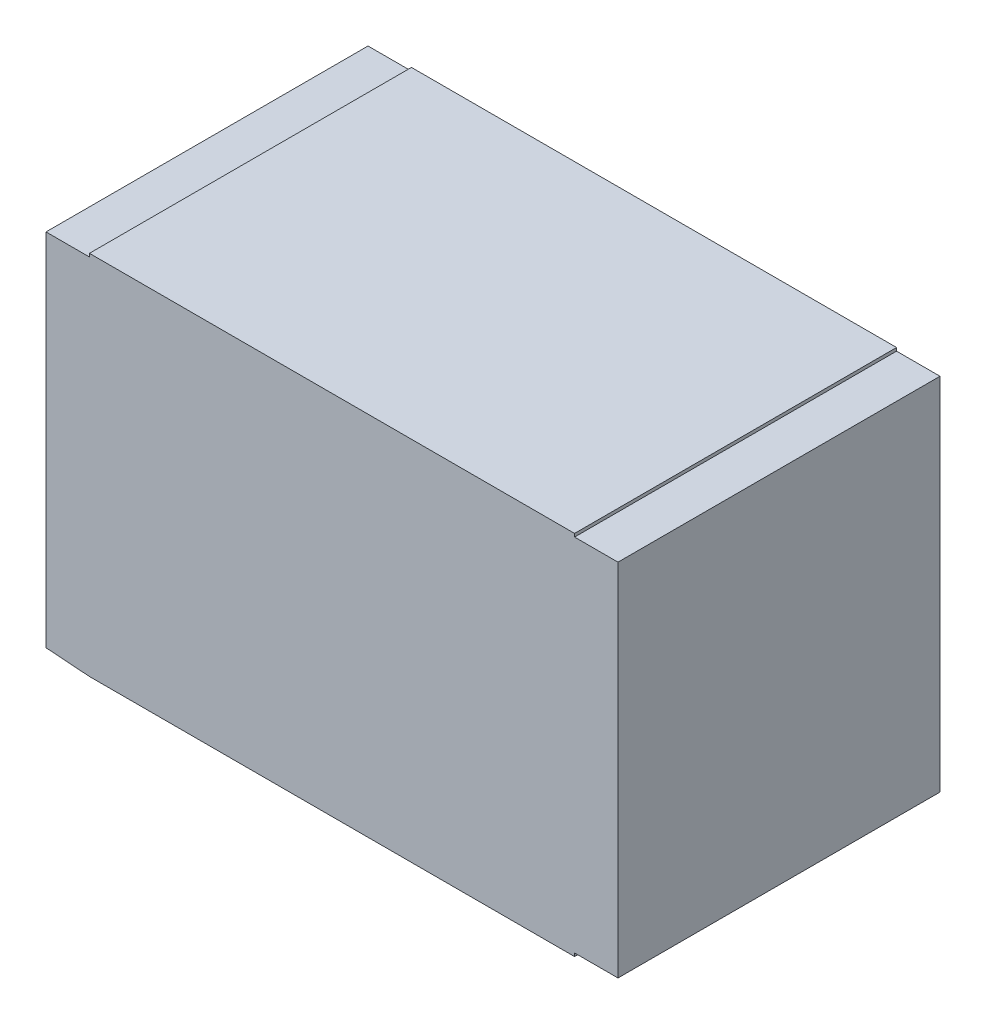
ISO-10303-21;
HEADER;
FILE_DESCRIPTION(('STEP AP214'),'2;1');
FILE_NAME('part.step','',(''),(''),'','','');
FILE_SCHEMA(('AUTOMOTIVE_DESIGN { 1 0 10303 214 1 1 1 1 }'));
ENDSEC;
DATA;
#1=APPLICATION_CONTEXT('core data for automotive mechanical design processes');
#2=APPLICATION_PROTOCOL_DEFINITION('international standard','automotive_design',2000,#1);
#3=PRODUCT_CONTEXT('',#1,'mechanical');
#4=PRODUCT('Part','Part','',(#3));
#5=PRODUCT_RELATED_PRODUCT_CATEGORY('part','',(#4));
#6=PRODUCT_DEFINITION_FORMATION('','',#4);
#7=PRODUCT_DEFINITION_CONTEXT('part definition',#1,'design');
#8=PRODUCT_DEFINITION('design','',#6,#7);
#9=PRODUCT_DEFINITION_SHAPE('','',#8);
#10=(LENGTH_UNIT() NAMED_UNIT(*) SI_UNIT(.MILLI.,.METRE.));
#11=(NAMED_UNIT(*) PLANE_ANGLE_UNIT() SI_UNIT($,.RADIAN.));
#12=(NAMED_UNIT(*) SI_UNIT($,.STERADIAN.) SOLID_ANGLE_UNIT());
#13=UNCERTAINTY_MEASURE_WITH_UNIT(LENGTH_MEASURE(1.E-05),#10,'distance_accuracy_value','');
#14=(GEOMETRIC_REPRESENTATION_CONTEXT(3) GLOBAL_UNCERTAINTY_ASSIGNED_CONTEXT((#13)) GLOBAL_UNIT_ASSIGNED_CONTEXT((#10,
#11,#12)) REPRESENTATION_CONTEXT('',''));
#15=CARTESIAN_POINT('',(0.,0.,0.));
#16=DIRECTION('',(0.,0.,1.));
#17=DIRECTION('',(1.,0.,0.));
#18=AXIS2_PLACEMENT_3D('',#15,#16,#17);
#19=CARTESIAN_POINT('',(-1.35,-0.85,1.52));
#20=DIRECTION('',(1.,0.,0.));
#21=DIRECTION('',(0.,0.,-1.));
#22=AXIS2_PLACEMENT_3D('',#19,#20,#21);
#23=PLANE('',#22);
#24=DIRECTION('',(0.,-1.,0.));
#25=VECTOR('',#24,1.);
#26=CARTESIAN_POINT('',(-1.35,-0.85,0.));
#27=LINE('',#26,#25);
#28=CARTESIAN_POINT('',(-1.35,0.85,0.));
#29=VERTEX_POINT('',#28);
#30=CARTESIAN_POINT('',(-1.35,-0.85,0.));
#31=VERTEX_POINT('',#30);
#32=EDGE_CURVE('E148',#29,#31,#27,.T.);
#33=ORIENTED_EDGE('',*,*,#32,.T.);
#34=DIRECTION('',(0.,0.,-1.));
#35=VECTOR('',#34,1.);
#36=CARTESIAN_POINT('',(-1.35,-0.85,1.52));
#37=LINE('',#36,#35);
#38=CARTESIAN_POINT('',(-1.35,-0.85,1.52));
#39=VERTEX_POINT('',#38);
#40=EDGE_CURVE('E11',#39,#31,#37,.T.);
#41=ORIENTED_EDGE('',*,*,#40,.F.);
#42=DIRECTION('',(0.,-1.,0.));
#43=VECTOR('',#42,1.);
#44=CARTESIAN_POINT('',(-1.35,-0.85,1.52));
#45=LINE('',#44,#43);
#46=CARTESIAN_POINT('',(-1.35,0.85,1.52));
#47=VERTEX_POINT('',#46);
#48=EDGE_CURVE('E168',#47,#39,#45,.T.);
#49=ORIENTED_EDGE('',*,*,#48,.F.);
#50=DIRECTION('',(0.,0.,-1.));
#51=VECTOR('',#50,1.);
#52=CARTESIAN_POINT('',(-1.35,0.85,1.52));
#53=LINE('',#52,#51);
#54=EDGE_CURVE('E144',#47,#29,#53,.T.);
#55=ORIENTED_EDGE('',*,*,#54,.T.);
#56=EDGE_LOOP('',(#33,#41,#49,#55));
#57=FACE_BOUND('',#56,.T.);
#58=ADVANCED_FACE('F34',(#57),#23,.F.);
#59=CARTESIAN_POINT('',(-1.145,-0.865,1.52));
#60=DIRECTION('',(0.0729756383115781,0.997333723591566,0.));
#61=DIRECTION('',(-0.997333723591566,0.0729756383115781,0.));
#62=AXIS2_PLACEMENT_3D('',#59,#60,#61);
#63=PLANE('',#62);
#64=DIRECTION('',(0.997333723591566,-0.0729756383115781,0.));
#65=VECTOR('',#64,1.);
#66=CARTESIAN_POINT('',(-1.145,-0.865,0.));
#67=LINE('',#66,#65);
#68=CARTESIAN_POINT('',(-1.145,-0.865,0.));
#69=VERTEX_POINT('',#68);
#70=EDGE_CURVE('E151',#31,#69,#67,.T.);
#71=ORIENTED_EDGE('',*,*,#70,.T.);
#72=DIRECTION('',(0.,0.,-1.));
#73=VECTOR('',#72,1.);
#74=CARTESIAN_POINT('',(-1.145,-0.865,1.52));
#75=LINE('',#74,#73);
#76=CARTESIAN_POINT('',(-1.145,-0.865,1.52));
#77=VERTEX_POINT('',#76);
#78=EDGE_CURVE('E42',#77,#69,#75,.T.);
#79=ORIENTED_EDGE('',*,*,#78,.F.);
#80=DIRECTION('',(0.997333723591566,-0.0729756383115781,0.));
#81=VECTOR('',#80,1.);
#82=CARTESIAN_POINT('',(-1.145,-0.865,1.52));
#83=LINE('',#82,#81);
#84=EDGE_CURVE('E102',#39,#77,#83,.T.);
#85=ORIENTED_EDGE('',*,*,#84,.F.);
#86=ORIENTED_EDGE('',*,*,#40,.T.);
#87=EDGE_LOOP('',(#71,#79,#85,#86));
#88=FACE_BOUND('',#87,.T.);
#89=ADVANCED_FACE('F240',(#88),#63,.F.);
#90=CARTESIAN_POINT('',(1.145,-0.865,1.52));
#91=DIRECTION('',(0.,1.,0.));
#92=DIRECTION('',(0.,0.,1.));
#93=AXIS2_PLACEMENT_3D('',#90,#91,#92);
#94=PLANE('',#93);
#95=DIRECTION('',(1.,0.,0.));
#96=VECTOR('',#95,1.);
#97=CARTESIAN_POINT('',(1.145,-0.865,0.));
#98=LINE('',#97,#96);
#99=CARTESIAN_POINT('',(1.145,-0.865,0.));
#100=VERTEX_POINT('',#99);
#101=EDGE_CURVE('E153',#69,#100,#98,.T.);
#102=ORIENTED_EDGE('',*,*,#101,.T.);
#103=DIRECTION('',(0.,0.,-1.));
#104=VECTOR('',#103,1.);
#105=CARTESIAN_POINT('',(1.145,-0.865,1.52));
#106=LINE('',#105,#104);
#107=CARTESIAN_POINT('',(1.145,-0.865,1.52));
#108=VERTEX_POINT('',#107);
#109=EDGE_CURVE('E184',#108,#100,#106,.T.);
#110=ORIENTED_EDGE('',*,*,#109,.F.);
#111=DIRECTION('',(1.,0.,0.));
#112=VECTOR('',#111,1.);
#113=CARTESIAN_POINT('',(1.145,-0.865,1.52));
#114=LINE('',#113,#112);
#115=EDGE_CURVE('E192',#77,#108,#114,.T.);
#116=ORIENTED_EDGE('',*,*,#115,.F.);
#117=ORIENTED_EDGE('',*,*,#78,.T.);
#118=EDGE_LOOP('',(#102,#110,#116,#117));
#119=FACE_BOUND('',#118,.T.);
#120=ADVANCED_FACE('F190',(#119),#94,.F.);
#121=CARTESIAN_POINT('',(1.145,-0.85,1.52));
#122=DIRECTION('',(-1.,0.,0.));
#123=DIRECTION('',(0.,0.,1.));
#124=AXIS2_PLACEMENT_3D('',#121,#122,#123);
#125=PLANE('',#124);
#126=DIRECTION('',(0.,1.,0.));
#127=VECTOR('',#126,1.);
#128=CARTESIAN_POINT('',(1.145,-0.85,0.));
#129=LINE('',#128,#127);
#130=CARTESIAN_POINT('',(1.145,-0.85,0.));
#131=VERTEX_POINT('',#130);
#132=EDGE_CURVE('E155',#100,#131,#129,.T.);
#133=ORIENTED_EDGE('',*,*,#132,.T.);
#134=DIRECTION('',(0.,0.,-1.));
#135=VECTOR('',#134,1.);
#136=CARTESIAN_POINT('',(1.145,-0.85,1.52));
#137=LINE('',#136,#135);
#138=CARTESIAN_POINT('',(1.145,-0.85,1.52));
#139=VERTEX_POINT('',#138);
#140=EDGE_CURVE('E181',#139,#131,#137,.T.);
#141=ORIENTED_EDGE('',*,*,#140,.F.);
#142=DIRECTION('',(0.,1.,0.));
#143=VECTOR('',#142,1.);
#144=CARTESIAN_POINT('',(1.145,-0.85,1.52));
#145=LINE('',#144,#143);
#146=EDGE_CURVE('E210',#108,#139,#145,.T.);
#147=ORIENTED_EDGE('',*,*,#146,.F.);
#148=ORIENTED_EDGE('',*,*,#109,.T.);
#149=EDGE_LOOP('',(#133,#141,#147,#148));
#150=FACE_BOUND('',#149,.T.);
#151=ADVANCED_FACE('F201',(#150),#125,.F.);
#152=CARTESIAN_POINT('',(1.35,-0.85,1.52));
#153=DIRECTION('',(0.,1.,0.));
#154=DIRECTION('',(0.,0.,1.));
#155=AXIS2_PLACEMENT_3D('',#152,#153,#154);
#156=PLANE('',#155);
#157=DIRECTION('',(1.,0.,0.));
#158=VECTOR('',#157,1.);
#159=CARTESIAN_POINT('',(1.35,-0.85,0.));
#160=LINE('',#159,#158);
#161=CARTESIAN_POINT('',(1.35,-0.85,0.));
#162=VERTEX_POINT('',#161);
#163=EDGE_CURVE('E157',#131,#162,#160,.T.);
#164=ORIENTED_EDGE('',*,*,#163,.T.);
#165=DIRECTION('',(0.,0.,-1.));
#166=VECTOR('',#165,1.);
#167=CARTESIAN_POINT('',(1.35,-0.85,1.52));
#168=LINE('',#167,#166);
#169=CARTESIAN_POINT('',(1.35,-0.85,1.52));
#170=VERTEX_POINT('',#169);
#171=EDGE_CURVE('E178',#170,#162,#168,.T.);
#172=ORIENTED_EDGE('',*,*,#171,.F.);
#173=DIRECTION('',(1.,0.,0.));
#174=VECTOR('',#173,1.);
#175=CARTESIAN_POINT('',(1.35,-0.85,1.52));
#176=LINE('',#175,#174);
#177=EDGE_CURVE('E207',#139,#170,#176,.T.);
#178=ORIENTED_EDGE('',*,*,#177,.F.);
#179=ORIENTED_EDGE('',*,*,#140,.T.);
#180=EDGE_LOOP('',(#164,#172,#178,#179));
#181=FACE_BOUND('',#180,.T.);
#182=ADVANCED_FACE('F205',(#181),#156,.F.);
#183=CARTESIAN_POINT('',(1.35,0.85,1.52));
#184=DIRECTION('',(-1.,0.,0.));
#185=DIRECTION('',(0.,0.,1.));
#186=AXIS2_PLACEMENT_3D('',#183,#184,#185);
#187=PLANE('',#186);
#188=DIRECTION('',(0.,1.,0.));
#189=VECTOR('',#188,1.);
#190=CARTESIAN_POINT('',(1.35,0.85,0.));
#191=LINE('',#190,#189);
#192=CARTESIAN_POINT('',(1.35,0.85,0.));
#193=VERTEX_POINT('',#192);
#194=EDGE_CURVE('E159',#162,#193,#191,.T.);
#195=ORIENTED_EDGE('',*,*,#194,.T.);
#196=DIRECTION('',(0.,0.,-1.));
#197=VECTOR('',#196,1.);
#198=CARTESIAN_POINT('',(1.35,0.85,1.52));
#199=LINE('',#198,#197);
#200=CARTESIAN_POINT('',(1.35,0.85,1.52));
#201=VERTEX_POINT('',#200);
#202=EDGE_CURVE('E175',#201,#193,#199,.T.);
#203=ORIENTED_EDGE('',*,*,#202,.F.);
#204=DIRECTION('',(0.,1.,0.));
#205=VECTOR('',#204,1.);
#206=CARTESIAN_POINT('',(1.35,0.85,1.52));
#207=LINE('',#206,#205);
#208=EDGE_CURVE('E209',#170,#201,#207,.T.);
#209=ORIENTED_EDGE('',*,*,#208,.F.);
#210=ORIENTED_EDGE('',*,*,#171,.T.);
#211=EDGE_LOOP('',(#195,#203,#209,#210));
#212=FACE_BOUND('',#211,.T.);
#213=ADVANCED_FACE('F253',(#212),#187,.F.);
#214=CARTESIAN_POINT('',(1.145,0.85,1.52));
#215=DIRECTION('',(0.,-1.,0.));
#216=DIRECTION('',(0.,0.,-1.));
#217=AXIS2_PLACEMENT_3D('',#214,#215,#216);
#218=PLANE('',#217);
#219=DIRECTION('',(-1.,0.,0.));
#220=VECTOR('',#219,1.);
#221=CARTESIAN_POINT('',(1.145,0.85,0.));
#222=LINE('',#221,#220);
#223=CARTESIAN_POINT('',(1.145,0.85,0.));
#224=VERTEX_POINT('',#223);
#225=EDGE_CURVE('E161',#193,#224,#222,.T.);
#226=ORIENTED_EDGE('',*,*,#225,.T.);
#227=DIRECTION('',(0.,0.,-1.));
#228=VECTOR('',#227,1.);
#229=CARTESIAN_POINT('',(1.145,0.85,1.52));
#230=LINE('',#229,#228);
#231=CARTESIAN_POINT('',(1.145,0.85,1.52));
#232=VERTEX_POINT('',#231);
#233=EDGE_CURVE('E172',#232,#224,#230,.T.);
#234=ORIENTED_EDGE('',*,*,#233,.F.);
#235=DIRECTION('',(-1.,0.,0.));
#236=VECTOR('',#235,1.);
#237=CARTESIAN_POINT('',(1.145,0.85,1.52));
#238=LINE('',#237,#236);
#239=EDGE_CURVE('E212',#201,#232,#238,.T.);
#240=ORIENTED_EDGE('',*,*,#239,.F.);
#241=ORIENTED_EDGE('',*,*,#202,.T.);
#242=EDGE_LOOP('',(#226,#234,#240,#241));
#243=FACE_BOUND('',#242,.T.);
#244=ADVANCED_FACE('F221',(#243),#218,.F.);
#245=CARTESIAN_POINT('',(1.145,0.865,1.52));
#246=DIRECTION('',(-1.,0.,0.));
#247=DIRECTION('',(0.,0.,1.));
#248=AXIS2_PLACEMENT_3D('',#245,#246,#247);
#249=PLANE('',#248);
#250=DIRECTION('',(0.,1.,0.));
#251=VECTOR('',#250,1.);
#252=CARTESIAN_POINT('',(1.145,0.865,0.));
#253=LINE('',#252,#251);
#254=CARTESIAN_POINT('',(1.145,0.865,0.));
#255=VERTEX_POINT('',#254);
#256=EDGE_CURVE('E163',#224,#255,#253,.T.);
#257=ORIENTED_EDGE('',*,*,#256,.T.);
#258=DIRECTION('',(0.,0.,-1.));
#259=VECTOR('',#258,1.);
#260=CARTESIAN_POINT('',(1.145,0.865,1.52));
#261=LINE('',#260,#259);
#262=CARTESIAN_POINT('',(1.145,0.865,1.52));
#263=VERTEX_POINT('',#262);
#264=EDGE_CURVE('E139',#263,#255,#261,.T.);
#265=ORIENTED_EDGE('',*,*,#264,.F.);
#266=DIRECTION('',(0.,1.,0.));
#267=VECTOR('',#266,1.);
#268=CARTESIAN_POINT('',(1.145,0.865,1.52));
#269=LINE('',#268,#267);
#270=EDGE_CURVE('E130',#232,#263,#269,.T.);
#271=ORIENTED_EDGE('',*,*,#270,.F.);
#272=ORIENTED_EDGE('',*,*,#233,.T.);
#273=EDGE_LOOP('',(#257,#265,#271,#272));
#274=FACE_BOUND('',#273,.T.);
#275=ADVANCED_FACE('F225',(#274),#249,.F.);
#276=CARTESIAN_POINT('',(-1.145,0.865,1.52));
#277=DIRECTION('',(0.,-1.,0.));
#278=DIRECTION('',(0.,0.,-1.));
#279=AXIS2_PLACEMENT_3D('',#276,#277,#278);
#280=PLANE('',#279);
#281=DIRECTION('',(-1.,0.,0.));
#282=VECTOR('',#281,1.);
#283=CARTESIAN_POINT('',(-1.145,0.865,0.));
#284=LINE('',#283,#282);
#285=CARTESIAN_POINT('',(-1.145,0.865,0.));
#286=VERTEX_POINT('',#285);
#287=EDGE_CURVE('E138',#255,#286,#284,.T.);
#288=ORIENTED_EDGE('',*,*,#287,.T.);
#289=DIRECTION('',(0.,0.,-1.));
#290=VECTOR('',#289,1.);
#291=CARTESIAN_POINT('',(-1.145,0.865,1.52));
#292=LINE('',#291,#290);
#293=CARTESIAN_POINT('',(-1.145,0.865,1.52));
#294=VERTEX_POINT('',#293);
#295=EDGE_CURVE('E135',#294,#286,#292,.T.);
#296=ORIENTED_EDGE('',*,*,#295,.F.);
#297=DIRECTION('',(-1.,0.,0.));
#298=VECTOR('',#297,1.);
#299=CARTESIAN_POINT('',(-1.145,0.865,1.52));
#300=LINE('',#299,#298);
#301=EDGE_CURVE('E124',#263,#294,#300,.T.);
#302=ORIENTED_EDGE('',*,*,#301,.F.);
#303=ORIENTED_EDGE('',*,*,#264,.T.);
#304=EDGE_LOOP('',(#288,#296,#302,#303));
#305=FACE_BOUND('',#304,.T.);
#306=ADVANCED_FACE('F136',(#305),#280,.F.);
#307=CARTESIAN_POINT('',(-1.145,0.85,1.52));
#308=DIRECTION('',(1.,0.,0.));
#309=DIRECTION('',(0.,0.,-1.));
#310=AXIS2_PLACEMENT_3D('',#307,#308,#309);
#311=PLANE('',#310);
#312=DIRECTION('',(0.,-1.,0.));
#313=VECTOR('',#312,1.);
#314=CARTESIAN_POINT('',(-1.145,0.85,0.));
#315=LINE('',#314,#313);
#316=CARTESIAN_POINT('',(-1.145,0.85,0.));
#317=VERTEX_POINT('',#316);
#318=EDGE_CURVE('E88',#286,#317,#315,.T.);
#319=ORIENTED_EDGE('',*,*,#318,.T.);
#320=DIRECTION('',(0.,0.,-1.));
#321=VECTOR('',#320,1.);
#322=CARTESIAN_POINT('',(-1.145,0.85,1.52));
#323=LINE('',#322,#321);
#324=CARTESIAN_POINT('',(-1.145,0.85,1.52));
#325=VERTEX_POINT('',#324);
#326=EDGE_CURVE('E140',#325,#317,#323,.T.);
#327=ORIENTED_EDGE('',*,*,#326,.F.);
#328=DIRECTION('',(0.,-1.,0.));
#329=VECTOR('',#328,1.);
#330=CARTESIAN_POINT('',(-1.145,0.85,1.52));
#331=LINE('',#330,#329);
#332=EDGE_CURVE('E128',#294,#325,#331,.T.);
#333=ORIENTED_EDGE('',*,*,#332,.F.);
#334=ORIENTED_EDGE('',*,*,#295,.T.);
#335=EDGE_LOOP('',(#319,#327,#333,#334));
#336=FACE_BOUND('',#335,.T.);
#337=ADVANCED_FACE('F142',(#336),#311,.F.);
#338=CARTESIAN_POINT('',(-1.35,0.85,1.52));
#339=DIRECTION('',(0.,-1.,0.));
#340=DIRECTION('',(0.,0.,-1.));
#341=AXIS2_PLACEMENT_3D('',#338,#339,#340);
#342=PLANE('',#341);
#343=DIRECTION('',(-1.,0.,0.));
#344=VECTOR('',#343,1.);
#345=CARTESIAN_POINT('',(-1.35,0.85,0.));
#346=LINE('',#345,#344);
#347=EDGE_CURVE('E94',#317,#29,#346,.T.);
#348=ORIENTED_EDGE('',*,*,#347,.T.);
#349=ORIENTED_EDGE('',*,*,#54,.F.);
#350=DIRECTION('',(-1.,0.,0.));
#351=VECTOR('',#350,1.);
#352=CARTESIAN_POINT('',(-1.35,0.85,1.52));
#353=LINE('',#352,#351);
#354=EDGE_CURVE('E50',#325,#47,#353,.T.);
#355=ORIENTED_EDGE('',*,*,#354,.F.);
#356=ORIENTED_EDGE('',*,*,#326,.T.);
#357=EDGE_LOOP('',(#348,#349,#355,#356));
#358=FACE_BOUND('',#357,.T.);
#359=ADVANCED_FACE('F229',(#358),#342,.F.);
#360=CARTESIAN_POINT('',(0.,0.,1.52));
#361=DIRECTION('',(0.,0.,-1.));
#362=DIRECTION('',(-1.,0.,0.));
#363=AXIS2_PLACEMENT_3D('',#360,#361,#362);
#364=PLANE('',#363);
#365=ORIENTED_EDGE('',*,*,#48,.T.);
#366=ORIENTED_EDGE('',*,*,#84,.T.);
#367=ORIENTED_EDGE('',*,*,#115,.T.);
#368=ORIENTED_EDGE('',*,*,#146,.T.);
#369=ORIENTED_EDGE('',*,*,#177,.T.);
#370=ORIENTED_EDGE('',*,*,#208,.T.);
#371=ORIENTED_EDGE('',*,*,#239,.T.);
#372=ORIENTED_EDGE('',*,*,#270,.T.);
#373=ORIENTED_EDGE('',*,*,#301,.T.);
#374=ORIENTED_EDGE('',*,*,#332,.T.);
#375=ORIENTED_EDGE('',*,*,#354,.T.);
#376=EDGE_LOOP('',(#365,#366,#367,#368,#369,#370,#371,#372,#373,#374,#375));
#377=FACE_BOUND('',#376,.T.);
#378=ADVANCED_FACE('F126',(#377),#364,.F.);
#379=CARTESIAN_POINT('',(0.,0.,0.));
#380=DIRECTION('',(0.,0.,-1.));
#381=DIRECTION('',(-1.,0.,0.));
#382=AXIS2_PLACEMENT_3D('',#379,#380,#381);
#383=PLANE('',#382);
#384=ORIENTED_EDGE('',*,*,#32,.F.);
#385=ORIENTED_EDGE('',*,*,#347,.F.);
#386=ORIENTED_EDGE('',*,*,#318,.F.);
#387=ORIENTED_EDGE('',*,*,#287,.F.);
#388=ORIENTED_EDGE('',*,*,#256,.F.);
#389=ORIENTED_EDGE('',*,*,#225,.F.);
#390=ORIENTED_EDGE('',*,*,#194,.F.);
#391=ORIENTED_EDGE('',*,*,#163,.F.);
#392=ORIENTED_EDGE('',*,*,#132,.F.);
#393=ORIENTED_EDGE('',*,*,#101,.F.);
#394=ORIENTED_EDGE('',*,*,#70,.F.);
#395=EDGE_LOOP('',(#384,#385,#386,#387,#388,#389,#390,#391,#392,#393,#394));
#396=FACE_BOUND('',#395,.T.);
#397=ADVANCED_FACE('F196',(#396),#383,.T.);
#398=CLOSED_SHELL('',(#58,#89,#120,#151,#182,#213,#244,#275,#306,#337,#359,#378,#397));
#399=MANIFOLD_SOLID_BREP('B2',#398);
#400=ADVANCED_BREP_SHAPE_REPRESENTATION('',(#18,#399),#14);
#401=SHAPE_DEFINITION_REPRESENTATION(#9,#400);
ENDSEC;
END-ISO-10303-21;
